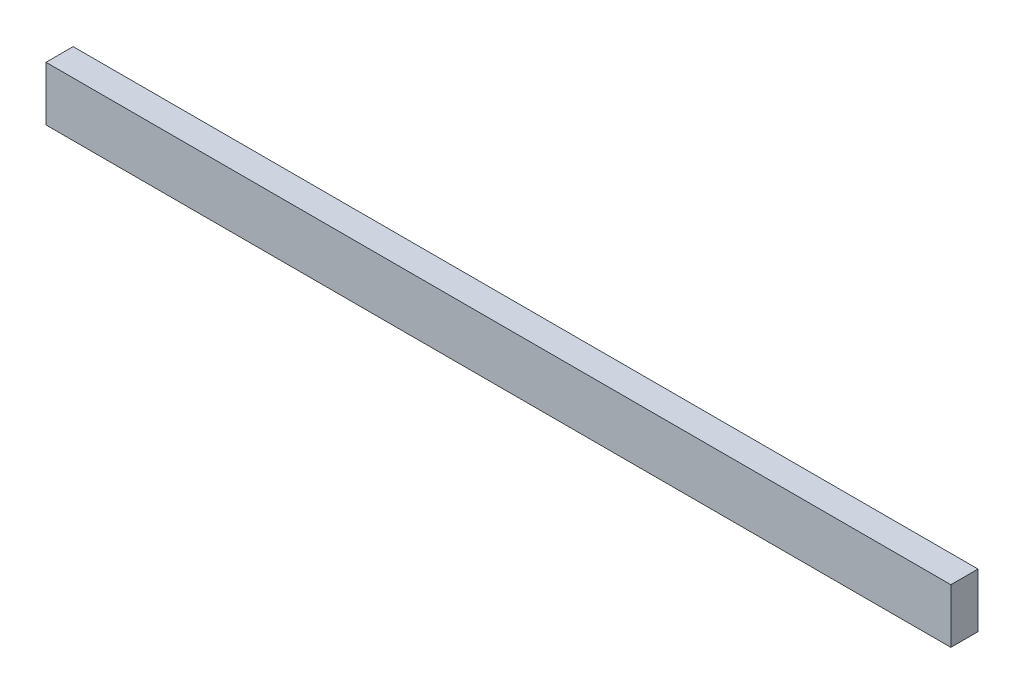
ISO-10303-21;
HEADER;
FILE_DESCRIPTION(('STEP AP214'),'2;1');
FILE_NAME('part.step','',(''),(''),'','','');
FILE_SCHEMA(('AUTOMOTIVE_DESIGN { 1 0 10303 214 1 1 1 1 }'));
ENDSEC;
DATA;
#1=APPLICATION_CONTEXT('core data for automotive mechanical design processes');
#2=APPLICATION_PROTOCOL_DEFINITION('international standard','automotive_design',2000,#1);
#3=PRODUCT_CONTEXT('',#1,'mechanical');
#4=PRODUCT('Part','Part','',(#3));
#5=PRODUCT_RELATED_PRODUCT_CATEGORY('part','',(#4));
#6=PRODUCT_DEFINITION_FORMATION('','',#4);
#7=PRODUCT_DEFINITION_CONTEXT('part definition',#1,'design');
#8=PRODUCT_DEFINITION('design','',#6,#7);
#9=PRODUCT_DEFINITION_SHAPE('','',#8);
#10=(LENGTH_UNIT() NAMED_UNIT(*) SI_UNIT(.MILLI.,.METRE.));
#11=(NAMED_UNIT(*) PLANE_ANGLE_UNIT() SI_UNIT($,.RADIAN.));
#12=(NAMED_UNIT(*) SI_UNIT($,.STERADIAN.) SOLID_ANGLE_UNIT());
#13=UNCERTAINTY_MEASURE_WITH_UNIT(LENGTH_MEASURE(1.E-05),#10,'distance_accuracy_value','');
#14=(GEOMETRIC_REPRESENTATION_CONTEXT(3) GLOBAL_UNCERTAINTY_ASSIGNED_CONTEXT((#13)) GLOBAL_UNIT_ASSIGNED_CONTEXT((#10,
#11,#12)) REPRESENTATION_CONTEXT('',''));
#15=CARTESIAN_POINT('',(0.,0.,0.));
#16=DIRECTION('',(0.,0.,1.));
#17=DIRECTION('',(1.,0.,0.));
#18=AXIS2_PLACEMENT_3D('',#15,#16,#17);
#19=CARTESIAN_POINT('',(50.,3.,3.));
#20=DIRECTION('',(-1.,0.,0.));
#21=DIRECTION('',(0.,0.,1.));
#22=AXIS2_PLACEMENT_3D('',#19,#20,#21);
#23=PLANE('',#22);
#24=DIRECTION('',(0.,1.,0.));
#25=VECTOR('',#24,1.);
#26=CARTESIAN_POINT('',(50.,3.,0.));
#27=LINE('',#26,#25);
#28=CARTESIAN_POINT('',(50.,-3.,0.));
#29=VERTEX_POINT('',#28);
#30=CARTESIAN_POINT('',(50.,3.,0.));
#31=VERTEX_POINT('',#30);
#32=EDGE_CURVE('E96',#29,#31,#27,.T.);
#33=ORIENTED_EDGE('',*,*,#32,.T.);
#34=DIRECTION('',(0.,0.,-1.));
#35=VECTOR('',#34,1.);
#36=CARTESIAN_POINT('',(50.,3.,3.));
#37=LINE('',#36,#35);
#38=CARTESIAN_POINT('',(50.,3.,3.));
#39=VERTEX_POINT('',#38);
#40=EDGE_CURVE('E11',#39,#31,#37,.T.);
#41=ORIENTED_EDGE('',*,*,#40,.F.);
#42=DIRECTION('',(0.,1.,0.));
#43=VECTOR('',#42,1.);
#44=CARTESIAN_POINT('',(50.,3.,3.));
#45=LINE('',#44,#43);
#46=CARTESIAN_POINT('',(50.,-3.,3.));
#47=VERTEX_POINT('',#46);
#48=EDGE_CURVE('E84',#47,#39,#45,.T.);
#49=ORIENTED_EDGE('',*,*,#48,.F.);
#50=DIRECTION('',(0.,0.,-1.));
#51=VECTOR('',#50,1.);
#52=CARTESIAN_POINT('',(50.,-3.,3.));
#53=LINE('',#52,#51);
#54=EDGE_CURVE('E92',#47,#29,#53,.T.);
#55=ORIENTED_EDGE('',*,*,#54,.T.);
#56=EDGE_LOOP('',(#33,#41,#49,#55));
#57=FACE_BOUND('',#56,.T.);
#58=ADVANCED_FACE('F33',(#57),#23,.F.);
#59=CARTESIAN_POINT('',(-50.,3.,3.));
#60=DIRECTION('',(0.,-1.,0.));
#61=DIRECTION('',(0.,0.,-1.));
#62=AXIS2_PLACEMENT_3D('',#59,#60,#61);
#63=PLANE('',#62);
#64=DIRECTION('',(-1.,0.,0.));
#65=VECTOR('',#64,1.);
#66=CARTESIAN_POINT('',(-50.,3.,0.));
#67=LINE('',#66,#65);
#68=CARTESIAN_POINT('',(-50.,3.,0.));
#69=VERTEX_POINT('',#68);
#70=EDGE_CURVE('E88',#31,#69,#67,.T.);
#71=ORIENTED_EDGE('',*,*,#70,.T.);
#72=DIRECTION('',(0.,0.,-1.));
#73=VECTOR('',#72,1.);
#74=CARTESIAN_POINT('',(-50.,3.,3.));
#75=LINE('',#74,#73);
#76=CARTESIAN_POINT('',(-50.,3.,3.));
#77=VERTEX_POINT('',#76);
#78=EDGE_CURVE('E41',#77,#69,#75,.T.);
#79=ORIENTED_EDGE('',*,*,#78,.F.);
#80=DIRECTION('',(-1.,0.,0.));
#81=VECTOR('',#80,1.);
#82=CARTESIAN_POINT('',(-50.,3.,3.));
#83=LINE('',#82,#81);
#84=EDGE_CURVE('E79',#39,#77,#83,.T.);
#85=ORIENTED_EDGE('',*,*,#84,.F.);
#86=ORIENTED_EDGE('',*,*,#40,.T.);
#87=EDGE_LOOP('',(#71,#79,#85,#86));
#88=FACE_BOUND('',#87,.T.);
#89=ADVANCED_FACE('F87',(#88),#63,.F.);
#90=CARTESIAN_POINT('',(-50.,3.,3.));
#91=DIRECTION('',(1.,0.,0.));
#92=DIRECTION('',(0.,0.,-1.));
#93=AXIS2_PLACEMENT_3D('',#90,#91,#92);
#94=PLANE('',#93);
#95=DIRECTION('',(0.,-1.,0.));
#96=VECTOR('',#95,1.);
#97=CARTESIAN_POINT('',(-50.,3.,0.));
#98=LINE('',#97,#96);
#99=CARTESIAN_POINT('',(-50.,-3.,0.));
#100=VERTEX_POINT('',#99);
#101=EDGE_CURVE('E66',#69,#100,#98,.T.);
#102=ORIENTED_EDGE('',*,*,#101,.T.);
#103=DIRECTION('',(0.,0.,-1.));
#104=VECTOR('',#103,1.);
#105=CARTESIAN_POINT('',(-50.,-3.,3.));
#106=LINE('',#105,#104);
#107=CARTESIAN_POINT('',(-50.,-3.,3.));
#108=VERTEX_POINT('',#107);
#109=EDGE_CURVE('E89',#108,#100,#106,.T.);
#110=ORIENTED_EDGE('',*,*,#109,.F.);
#111=DIRECTION('',(0.,-1.,0.));
#112=VECTOR('',#111,1.);
#113=CARTESIAN_POINT('',(-50.,3.,3.));
#114=LINE('',#113,#112);
#115=EDGE_CURVE('E82',#77,#108,#114,.T.);
#116=ORIENTED_EDGE('',*,*,#115,.F.);
#117=ORIENTED_EDGE('',*,*,#78,.T.);
#118=EDGE_LOOP('',(#102,#110,#116,#117));
#119=FACE_BOUND('',#118,.T.);
#120=ADVANCED_FACE('F90',(#119),#94,.F.);
#121=CARTESIAN_POINT('',(-50.,-3.,3.));
#122=DIRECTION('',(0.,1.,0.));
#123=DIRECTION('',(0.,0.,1.));
#124=AXIS2_PLACEMENT_3D('',#121,#122,#123);
#125=PLANE('',#124);
#126=DIRECTION('',(1.,0.,0.));
#127=VECTOR('',#126,1.);
#128=CARTESIAN_POINT('',(-50.,-3.,0.));
#129=LINE('',#128,#127);
#130=EDGE_CURVE('E72',#100,#29,#129,.T.);
#131=ORIENTED_EDGE('',*,*,#130,.T.);
#132=ORIENTED_EDGE('',*,*,#54,.F.);
#133=DIRECTION('',(1.,0.,0.));
#134=VECTOR('',#133,1.);
#135=CARTESIAN_POINT('',(-50.,-3.,3.));
#136=LINE('',#135,#134);
#137=EDGE_CURVE('E49',#108,#47,#136,.T.);
#138=ORIENTED_EDGE('',*,*,#137,.F.);
#139=ORIENTED_EDGE('',*,*,#109,.T.);
#140=EDGE_LOOP('',(#131,#132,#138,#139));
#141=FACE_BOUND('',#140,.T.);
#142=ADVANCED_FACE('F103',(#141),#125,.F.);
#143=CARTESIAN_POINT('',(0.,0.,3.));
#144=DIRECTION('',(0.,0.,1.));
#145=DIRECTION('',(1.,0.,0.));
#146=AXIS2_PLACEMENT_3D('',#143,#144,#145);
#147=PLANE('',#146);
#148=ORIENTED_EDGE('',*,*,#48,.T.);
#149=ORIENTED_EDGE('',*,*,#84,.T.);
#150=ORIENTED_EDGE('',*,*,#115,.T.);
#151=ORIENTED_EDGE('',*,*,#137,.T.);
#152=EDGE_LOOP('',(#148,#149,#150,#151));
#153=FACE_BOUND('',#152,.T.);
#154=ADVANCED_FACE('F80',(#153),#147,.T.);
#155=CARTESIAN_POINT('',(0.,0.,0.));
#156=DIRECTION('',(0.,0.,1.));
#157=DIRECTION('',(1.,0.,0.));
#158=AXIS2_PLACEMENT_3D('',#155,#156,#157);
#159=PLANE('',#158);
#160=ORIENTED_EDGE('',*,*,#32,.F.);
#161=ORIENTED_EDGE('',*,*,#130,.F.);
#162=ORIENTED_EDGE('',*,*,#101,.F.);
#163=ORIENTED_EDGE('',*,*,#70,.F.);
#164=EDGE_LOOP('',(#160,#161,#162,#163));
#165=FACE_BOUND('',#164,.T.);
#166=ADVANCED_FACE('F106',(#165),#159,.F.);
#167=CLOSED_SHELL('',(#58,#89,#120,#142,#154,#166));
#168=MANIFOLD_SOLID_BREP('B2',#167);
#169=ADVANCED_BREP_SHAPE_REPRESENTATION('',(#18,#168),#14);
#170=SHAPE_DEFINITION_REPRESENTATION(#9,#169);
ENDSEC;
END-ISO-10303-21;
